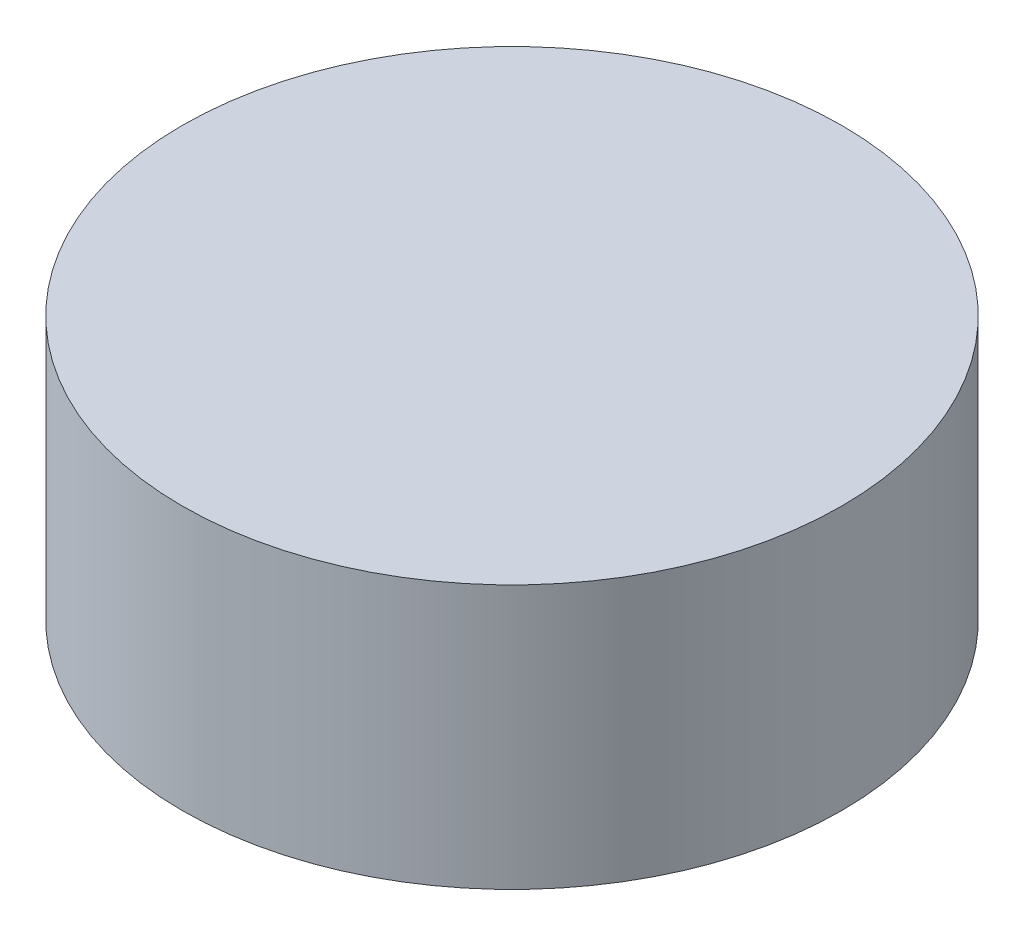
ISO-10303-21;
HEADER;
FILE_DESCRIPTION(('STEP AP214'),'2;1');
FILE_NAME('part.step','',(''),(''),'','','');
FILE_SCHEMA(('AUTOMOTIVE_DESIGN { 1 0 10303 214 1 1 1 1 }'));
ENDSEC;
DATA;
#1=APPLICATION_CONTEXT('core data for automotive mechanical design processes');
#2=APPLICATION_PROTOCOL_DEFINITION('international standard','automotive_design',2000,#1);
#3=PRODUCT_CONTEXT('',#1,'mechanical');
#4=PRODUCT('Part','Part','',(#3));
#5=PRODUCT_RELATED_PRODUCT_CATEGORY('part','',(#4));
#6=PRODUCT_DEFINITION_FORMATION('','',#4);
#7=PRODUCT_DEFINITION_CONTEXT('part definition',#1,'design');
#8=PRODUCT_DEFINITION('design','',#6,#7);
#9=PRODUCT_DEFINITION_SHAPE('','',#8);
#10=(LENGTH_UNIT() NAMED_UNIT(*) SI_UNIT(.MILLI.,.METRE.));
#11=(NAMED_UNIT(*) PLANE_ANGLE_UNIT() SI_UNIT($,.RADIAN.));
#12=(NAMED_UNIT(*) SI_UNIT($,.STERADIAN.) SOLID_ANGLE_UNIT());
#13=UNCERTAINTY_MEASURE_WITH_UNIT(LENGTH_MEASURE(1.E-05),#10,'distance_accuracy_value','');
#14=(GEOMETRIC_REPRESENTATION_CONTEXT(3) GLOBAL_UNCERTAINTY_ASSIGNED_CONTEXT((#13)) GLOBAL_UNIT_ASSIGNED_CONTEXT((#10,
#11,#12)) REPRESENTATION_CONTEXT('',''));
#15=CARTESIAN_POINT('',(0.,0.,0.));
#16=DIRECTION('',(0.,0.,1.));
#17=DIRECTION('',(1.,0.,0.));
#18=AXIS2_PLACEMENT_3D('',#15,#16,#17);
#19=CARTESIAN_POINT('',(0.,-10.16,0.));
#20=DIRECTION('',(0.,1.,0.));
#21=DIRECTION('',(0.,0.,1.));
#22=AXIS2_PLACEMENT_3D('',#19,#20,#21);
#23=CYLINDRICAL_SURFACE('',#22,12.7);
#24=CARTESIAN_POINT('',(0.,-10.16,0.));
#25=DIRECTION('',(0.,1.,0.));
#26=DIRECTION('',(0.,0.,1.));
#27=AXIS2_PLACEMENT_3D('',#24,#25,#26);
#28=CIRCLE('',#27,12.7);
#29=CARTESIAN_POINT('',(0.,-10.16,12.7));
#30=VERTEX_POINT('',#29);
#31=EDGE_CURVE('E10',#30,#30,#28,.T.);
#32=ORIENTED_EDGE('',*,*,#31,.T.);
#33=EDGE_LOOP('',(#32));
#34=FACE_BOUND('',#33,.T.);
#35=CARTESIAN_POINT('',(0.,0.,0.));
#36=DIRECTION('',(0.,1.,0.));
#37=DIRECTION('',(0.,0.,1.));
#38=AXIS2_PLACEMENT_3D('',#35,#36,#37);
#39=CIRCLE('',#38,12.7);
#40=CARTESIAN_POINT('',(0.,0.,12.7));
#41=VERTEX_POINT('',#40);
#42=EDGE_CURVE('E31',#41,#41,#39,.T.);
#43=ORIENTED_EDGE('',*,*,#42,.F.);
#44=EDGE_LOOP('',(#43));
#45=FACE_BOUND('',#44,.T.);
#46=ADVANCED_FACE('F28',(#34,#45),#23,.T.);
#47=CARTESIAN_POINT('',(0.,-10.16,0.));
#48=DIRECTION('',(0.,1.,0.));
#49=DIRECTION('',(0.,0.,1.));
#50=AXIS2_PLACEMENT_3D('',#47,#48,#49);
#51=PLANE('',#50);
#52=ORIENTED_EDGE('',*,*,#31,.F.);
#53=EDGE_LOOP('',(#52));
#54=FACE_BOUND('',#53,.T.);
#55=ADVANCED_FACE('F43',(#54),#51,.F.);
#56=CARTESIAN_POINT('',(0.,0.,0.));
#57=DIRECTION('',(0.,1.,0.));
#58=DIRECTION('',(0.,0.,1.));
#59=AXIS2_PLACEMENT_3D('',#56,#57,#58);
#60=PLANE('',#59);
#61=ORIENTED_EDGE('',*,*,#42,.T.);
#62=EDGE_LOOP('',(#61));
#63=FACE_BOUND('',#62,.T.);
#64=ADVANCED_FACE('F40',(#63),#60,.T.);
#65=CLOSED_SHELL('',(#46,#55,#64));
#66=MANIFOLD_SOLID_BREP('B2',#65);
#67=ADVANCED_BREP_SHAPE_REPRESENTATION('',(#18,#66),#14);
#68=SHAPE_DEFINITION_REPRESENTATION(#9,#67);
ENDSEC;
END-ISO-10303-21;
